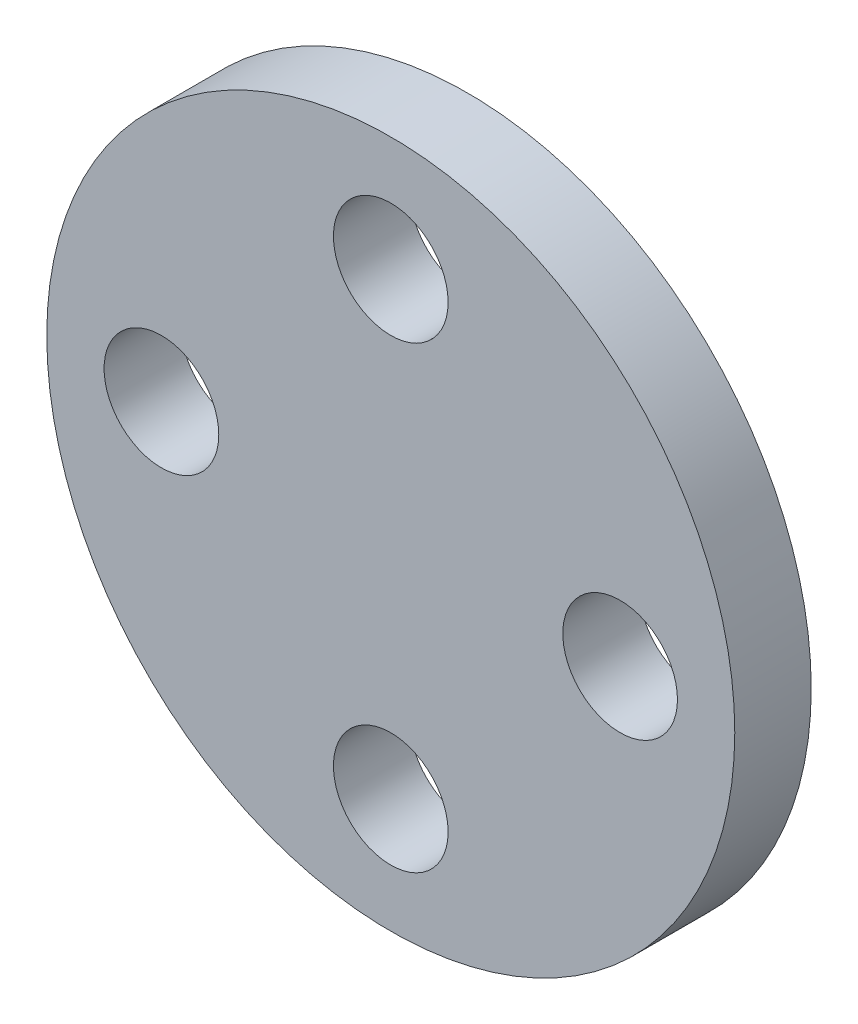
ISO-10303-21;
HEADER;
FILE_DESCRIPTION(('STEP AP214'),'2;1');
FILE_NAME('part.step','',(''),(''),'','','');
FILE_SCHEMA(('AUTOMOTIVE_DESIGN { 1 0 10303 214 1 1 1 1 }'));
ENDSEC;
DATA;
#1=APPLICATION_CONTEXT('core data for automotive mechanical design processes');
#2=APPLICATION_PROTOCOL_DEFINITION('international standard','automotive_design',2000,#1);
#3=PRODUCT_CONTEXT('',#1,'mechanical');
#4=PRODUCT('Part','Part','',(#3));
#5=PRODUCT_RELATED_PRODUCT_CATEGORY('part','',(#4));
#6=PRODUCT_DEFINITION_FORMATION('','',#4);
#7=PRODUCT_DEFINITION_CONTEXT('part definition',#1,'design');
#8=PRODUCT_DEFINITION('design','',#6,#7);
#9=PRODUCT_DEFINITION_SHAPE('','',#8);
#10=(LENGTH_UNIT() NAMED_UNIT(*) SI_UNIT(.MILLI.,.METRE.));
#11=(NAMED_UNIT(*) PLANE_ANGLE_UNIT() SI_UNIT($,.RADIAN.));
#12=(NAMED_UNIT(*) SI_UNIT($,.STERADIAN.) SOLID_ANGLE_UNIT());
#13=UNCERTAINTY_MEASURE_WITH_UNIT(LENGTH_MEASURE(1.E-05),#10,'distance_accuracy_value','');
#14=(GEOMETRIC_REPRESENTATION_CONTEXT(3) GLOBAL_UNCERTAINTY_ASSIGNED_CONTEXT((#13)) GLOBAL_UNIT_ASSIGNED_CONTEXT((#10,
#11,#12)) REPRESENTATION_CONTEXT('',''));
#15=CARTESIAN_POINT('',(0.,0.,0.));
#16=DIRECTION('',(0.,0.,1.));
#17=DIRECTION('',(1.,0.,0.));
#18=AXIS2_PLACEMENT_3D('',#15,#16,#17);
#19=CARTESIAN_POINT('',(0.,0.,3.175));
#20=DIRECTION('',(0.,0.,1.));
#21=DIRECTION('',(1.,0.,0.));
#22=AXIS2_PLACEMENT_3D('',#19,#20,#21);
#23=PLANE('',#22);
#24=CARTESIAN_POINT('',(5.39100612496821E-13,-9.525,3.175));
#25=DIRECTION('',(0.,0.,1.));
#26=DIRECTION('',(1.,0.,0.));
#27=AXIS2_PLACEMENT_3D('',#24,#25,#26);
#28=CIRCLE('',#27,2.38125000000058);
#29=CARTESIAN_POINT('',(2.38125000000112,-9.525,3.175));
#30=VERTEX_POINT('',#29);
#31=EDGE_CURVE('E53',#30,#30,#28,.T.);
#32=ORIENTED_EDGE('',*,*,#31,.F.);
#33=EDGE_LOOP('',(#32));
#34=FACE_BOUND('',#33,.T.);
#35=CARTESIAN_POINT('',(0.,9.525,3.175));
#36=DIRECTION('',(0.,0.,1.));
#37=DIRECTION('',(1.,0.,0.));
#38=AXIS2_PLACEMENT_3D('',#35,#36,#37);
#39=CIRCLE('',#38,2.38125);
#40=CARTESIAN_POINT('',(2.38125,9.525,3.175));
#41=VERTEX_POINT('',#40);
#42=EDGE_CURVE('E42',#41,#41,#39,.T.);
#43=ORIENTED_EDGE('',*,*,#42,.F.);
#44=EDGE_LOOP('',(#43));
#45=FACE_BOUND('',#44,.T.);
#46=CARTESIAN_POINT('',(0.,0.,3.175));
#47=DIRECTION('',(0.,0.,1.));
#48=DIRECTION('',(1.,0.,0.));
#49=AXIS2_PLACEMENT_3D('',#46,#47,#48);
#50=CIRCLE('',#49,14.2875);
#51=CARTESIAN_POINT('',(14.2875,0.,3.175));
#52=VERTEX_POINT('',#51);
#53=EDGE_CURVE('E10',#52,#52,#50,.T.);
#54=ORIENTED_EDGE('',*,*,#53,.T.);
#55=EDGE_LOOP('',(#54));
#56=FACE_BOUND('',#55,.T.);
#57=CARTESIAN_POINT('',(9.52500000000027,2.6955030624841E-13,3.175));
#58=DIRECTION('',(0.,0.,1.));
#59=DIRECTION('',(1.,0.,0.));
#60=AXIS2_PLACEMENT_3D('',#57,#58,#59);
#61=CIRCLE('',#60,2.38125000000021);
#62=CARTESIAN_POINT('',(11.9062500000005,2.6955030624841E-13,3.175));
#63=VERTEX_POINT('',#62);
#64=EDGE_CURVE('E47',#63,#63,#61,.T.);
#65=ORIENTED_EDGE('',*,*,#64,.F.);
#66=EDGE_LOOP('',(#65));
#67=FACE_BOUND('',#66,.T.);
#68=CARTESIAN_POINT('',(-9.52499999999973,-2.70716782324598E-13,3.175));
#69=DIRECTION('',(0.,0.,1.));
#70=DIRECTION('',(1.,0.,0.));
#71=AXIS2_PLACEMENT_3D('',#68,#69,#70);
#72=CIRCLE('',#71,2.38125000000043);
#73=CARTESIAN_POINT('',(-7.1437499999993,-2.70716782324598E-13,3.175));
#74=VERTEX_POINT('',#73);
#75=EDGE_CURVE('E59',#74,#74,#72,.T.);
#76=ORIENTED_EDGE('',*,*,#75,.F.);
#77=EDGE_LOOP('',(#76));
#78=FACE_BOUND('',#77,.T.);
#79=ADVANCED_FACE('F31',(#34,#45,#56,#67,#78),#23,.T.);
#80=CARTESIAN_POINT('',(0.,0.,0.));
#81=DIRECTION('',(0.,0.,1.));
#82=DIRECTION('',(1.,0.,0.));
#83=AXIS2_PLACEMENT_3D('',#80,#81,#82);
#84=PLANE('',#83);
#85=CARTESIAN_POINT('',(0.,0.,0.));
#86=DIRECTION('',(0.,0.,1.));
#87=DIRECTION('',(1.,0.,0.));
#88=AXIS2_PLACEMENT_3D('',#85,#86,#87);
#89=CIRCLE('',#88,14.2875);
#90=CARTESIAN_POINT('',(14.2875,0.,0.));
#91=VERTEX_POINT('',#90);
#92=EDGE_CURVE('E35',#91,#91,#89,.T.);
#93=ORIENTED_EDGE('',*,*,#92,.F.);
#94=EDGE_LOOP('',(#93));
#95=FACE_BOUND('',#94,.T.);
#96=CARTESIAN_POINT('',(0.,9.525,0.));
#97=DIRECTION('',(0.,0.,1.));
#98=DIRECTION('',(1.,0.,0.));
#99=AXIS2_PLACEMENT_3D('',#96,#97,#98);
#100=CIRCLE('',#99,2.38125);
#101=CARTESIAN_POINT('',(2.38125,9.525,0.));
#102=VERTEX_POINT('',#101);
#103=EDGE_CURVE('E44',#102,#102,#100,.T.);
#104=ORIENTED_EDGE('',*,*,#103,.T.);
#105=EDGE_LOOP('',(#104));
#106=FACE_BOUND('',#105,.T.);
#107=CARTESIAN_POINT('',(9.52500000000027,2.6955030624841E-13,0.));
#108=DIRECTION('',(0.,0.,1.));
#109=DIRECTION('',(1.,0.,0.));
#110=AXIS2_PLACEMENT_3D('',#107,#108,#109);
#111=CIRCLE('',#110,2.38125000000021);
#112=CARTESIAN_POINT('',(11.9062500000005,2.6955030624841E-13,0.));
#113=VERTEX_POINT('',#112);
#114=EDGE_CURVE('E50',#113,#113,#111,.T.);
#115=ORIENTED_EDGE('',*,*,#114,.T.);
#116=EDGE_LOOP('',(#115));
#117=FACE_BOUND('',#116,.T.);
#118=CARTESIAN_POINT('',(5.39100612496821E-13,-9.525,0.));
#119=DIRECTION('',(0.,0.,1.));
#120=DIRECTION('',(1.,0.,0.));
#121=AXIS2_PLACEMENT_3D('',#118,#119,#120);
#122=CIRCLE('',#121,2.38125000000058);
#123=CARTESIAN_POINT('',(2.38125000000112,-9.525,0.));
#124=VERTEX_POINT('',#123);
#125=EDGE_CURVE('E56',#124,#124,#122,.T.);
#126=ORIENTED_EDGE('',*,*,#125,.T.);
#127=EDGE_LOOP('',(#126));
#128=FACE_BOUND('',#127,.T.);
#129=CARTESIAN_POINT('',(-9.52499999999973,-2.70716782324598E-13,0.));
#130=DIRECTION('',(0.,0.,1.));
#131=DIRECTION('',(1.,0.,0.));
#132=AXIS2_PLACEMENT_3D('',#129,#130,#131);
#133=CIRCLE('',#132,2.38125000000043);
#134=CARTESIAN_POINT('',(-7.1437499999993,-2.70716782324598E-13,0.));
#135=VERTEX_POINT('',#134);
#136=EDGE_CURVE('E62',#135,#135,#133,.T.);
#137=ORIENTED_EDGE('',*,*,#136,.T.);
#138=EDGE_LOOP('',(#137));
#139=FACE_BOUND('',#138,.T.);
#140=ADVANCED_FACE('F72',(#95,#106,#117,#128,#139),#84,.F.);
#141=CARTESIAN_POINT('',(0.,0.,3.175));
#142=DIRECTION('',(0.,0.,-1.));
#143=DIRECTION('',(-1.,0.,0.));
#144=AXIS2_PLACEMENT_3D('',#141,#142,#143);
#145=CYLINDRICAL_SURFACE('',#144,14.2875);
#146=ORIENTED_EDGE('',*,*,#53,.F.);
#147=EDGE_LOOP('',(#146));
#148=FACE_BOUND('',#147,.T.);
#149=ORIENTED_EDGE('',*,*,#92,.T.);
#150=EDGE_LOOP('',(#149));
#151=FACE_BOUND('',#150,.T.);
#152=ADVANCED_FACE('F33',(#148,#151),#145,.T.);
#153=CARTESIAN_POINT('',(0.,9.525,3.175));
#154=DIRECTION('',(0.,0.,-1.));
#155=DIRECTION('',(-1.,0.,0.));
#156=AXIS2_PLACEMENT_3D('',#153,#154,#155);
#157=CYLINDRICAL_SURFACE('',#156,2.38125);
#158=ORIENTED_EDGE('',*,*,#42,.T.);
#159=EDGE_LOOP('',(#158));
#160=FACE_BOUND('',#159,.T.);
#161=ORIENTED_EDGE('',*,*,#103,.F.);
#162=EDGE_LOOP('',(#161));
#163=FACE_BOUND('',#162,.T.);
#164=ADVANCED_FACE('F82',(#160,#163),#157,.F.);
#165=CARTESIAN_POINT('',(9.52500000000027,2.6955030624841E-13,3.175));
#166=DIRECTION('',(0.,0.,-1.));
#167=DIRECTION('',(-1.,0.,0.));
#168=AXIS2_PLACEMENT_3D('',#165,#166,#167);
#169=CYLINDRICAL_SURFACE('',#168,2.38125000000021);
#170=ORIENTED_EDGE('',*,*,#64,.T.);
#171=EDGE_LOOP('',(#170));
#172=FACE_BOUND('',#171,.T.);
#173=ORIENTED_EDGE('',*,*,#114,.F.);
#174=EDGE_LOOP('',(#173));
#175=FACE_BOUND('',#174,.T.);
#176=ADVANCED_FACE('F85',(#172,#175),#169,.F.);
#177=CARTESIAN_POINT('',(5.39100612496821E-13,-9.525,3.175));
#178=DIRECTION('',(0.,0.,-1.));
#179=DIRECTION('',(-1.,0.,0.));
#180=AXIS2_PLACEMENT_3D('',#177,#178,#179);
#181=CYLINDRICAL_SURFACE('',#180,2.38125000000058);
#182=ORIENTED_EDGE('',*,*,#31,.T.);
#183=EDGE_LOOP('',(#182));
#184=FACE_BOUND('',#183,.T.);
#185=ORIENTED_EDGE('',*,*,#125,.F.);
#186=EDGE_LOOP('',(#185));
#187=FACE_BOUND('',#186,.T.);
#188=ADVANCED_FACE('F89',(#184,#187),#181,.F.);
#189=CARTESIAN_POINT('',(-9.52499999999973,-2.70716782324598E-13,3.175));
#190=DIRECTION('',(0.,0.,-1.));
#191=DIRECTION('',(-1.,0.,0.));
#192=AXIS2_PLACEMENT_3D('',#189,#190,#191);
#193=CYLINDRICAL_SURFACE('',#192,2.38125000000043);
#194=ORIENTED_EDGE('',*,*,#75,.T.);
#195=EDGE_LOOP('',(#194));
#196=FACE_BOUND('',#195,.T.);
#197=ORIENTED_EDGE('',*,*,#136,.F.);
#198=EDGE_LOOP('',(#197));
#199=FACE_BOUND('',#198,.T.);
#200=ADVANCED_FACE('F68',(#196,#199),#193,.F.);
#201=CLOSED_SHELL('',(#79,#140,#152,#164,#176,#188,#200));
#202=MANIFOLD_SOLID_BREP('B2',#201);
#203=ADVANCED_BREP_SHAPE_REPRESENTATION('',(#18,#202),#14);
#204=SHAPE_DEFINITION_REPRESENTATION(#9,#203);
ENDSEC;
END-ISO-10303-21;
